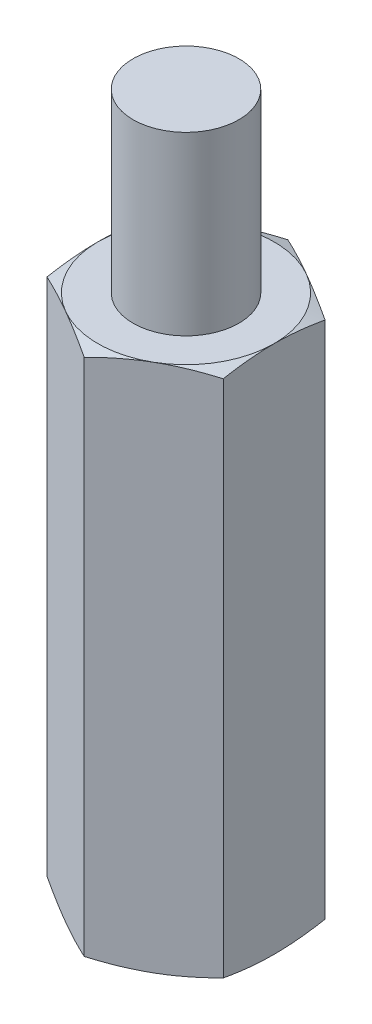
ISO-10303-21;
HEADER;
FILE_DESCRIPTION(('STEP AP214'),'2;1');
FILE_NAME('part.step','',(''),(''),'','','');
FILE_SCHEMA(('AUTOMOTIVE_DESIGN { 1 0 10303 214 1 1 1 1 }'));
ENDSEC;
DATA;
#1=APPLICATION_CONTEXT('core data for automotive mechanical design processes');
#2=APPLICATION_PROTOCOL_DEFINITION('international standard','automotive_design',2000,#1);
#3=PRODUCT_CONTEXT('',#1,'mechanical');
#4=PRODUCT('Part','Part','',(#3));
#5=PRODUCT_RELATED_PRODUCT_CATEGORY('part','',(#4));
#6=PRODUCT_DEFINITION_FORMATION('','',#4);
#7=PRODUCT_DEFINITION_CONTEXT('part definition',#1,'design');
#8=PRODUCT_DEFINITION('design','',#6,#7);
#9=PRODUCT_DEFINITION_SHAPE('','',#8);
#10=(LENGTH_UNIT() NAMED_UNIT(*) SI_UNIT(.MILLI.,.METRE.));
#11=(NAMED_UNIT(*) PLANE_ANGLE_UNIT() SI_UNIT($,.RADIAN.));
#12=(NAMED_UNIT(*) SI_UNIT($,.STERADIAN.) SOLID_ANGLE_UNIT());
#13=UNCERTAINTY_MEASURE_WITH_UNIT(LENGTH_MEASURE(1.E-05),#10,'distance_accuracy_value','');
#14=(GEOMETRIC_REPRESENTATION_CONTEXT(3) GLOBAL_UNCERTAINTY_ASSIGNED_CONTEXT((#13)) GLOBAL_UNIT_ASSIGNED_CONTEXT((#10,
#11,#12)) REPRESENTATION_CONTEXT('',''));
#15=CARTESIAN_POINT('',(0.,0.,0.));
#16=DIRECTION('',(0.,0.,1.));
#17=DIRECTION('',(1.,0.,0.));
#18=AXIS2_PLACEMENT_3D('',#15,#16,#17);
#19=CARTESIAN_POINT('',(0.,20.,0.));
#20=DIRECTION('',(0.,-1.,0.));
#21=DIRECTION('',(0.,0.,-1.));
#22=AXIS2_PLACEMENT_3D('',#19,#20,#21);
#23=CYLINDRICAL_SURFACE('',#22,1.5);
#24=CARTESIAN_POINT('',(0.,20.,0.));
#25=DIRECTION('',(0.,1.,0.));
#26=DIRECTION('',(0.,0.,1.));
#27=AXIS2_PLACEMENT_3D('',#24,#25,#26);
#28=CIRCLE('',#27,1.5);
#29=CARTESIAN_POINT('',(0.,20.,1.5));
#30=VERTEX_POINT('',#29);
#31=EDGE_CURVE('E11',#30,#30,#28,.T.);
#32=ORIENTED_EDGE('',*,*,#31,.F.);
#33=EDGE_LOOP('',(#32));
#34=FACE_BOUND('',#33,.T.);
#35=CARTESIAN_POINT('',(0.,15.,0.));
#36=DIRECTION('',(0.,1.,0.));
#37=DIRECTION('',(0.,0.,1.));
#38=AXIS2_PLACEMENT_3D('',#35,#36,#37);
#39=CIRCLE('',#38,1.5);
#40=CARTESIAN_POINT('',(0.,15.,1.5));
#41=VERTEX_POINT('',#40);
#42=EDGE_CURVE('E45',#41,#41,#39,.T.);
#43=ORIENTED_EDGE('',*,*,#42,.T.);
#44=EDGE_LOOP('',(#43));
#45=FACE_BOUND('',#44,.T.);
#46=ADVANCED_FACE('F42',(#34,#45),#23,.T.);
#47=CARTESIAN_POINT('',(0.,20.,0.));
#48=DIRECTION('',(0.,1.,0.));
#49=DIRECTION('',(0.,0.,1.));
#50=AXIS2_PLACEMENT_3D('',#47,#48,#49);
#51=PLANE('',#50);
#52=ORIENTED_EDGE('',*,*,#31,.T.);
#53=EDGE_LOOP('',(#52));
#54=FACE_BOUND('',#53,.T.);
#55=ADVANCED_FACE('F57',(#54),#51,.T.);
#56=CARTESIAN_POINT('',(0.,15.,0.));
#57=DIRECTION('',(0.,1.,0.));
#58=DIRECTION('',(0.,0.,1.));
#59=AXIS2_PLACEMENT_3D('',#56,#57,#58);
#60=PLANE('',#59);
#61=ORIENTED_EDGE('',*,*,#42,.F.);
#62=EDGE_LOOP('',(#61));
#63=FACE_BOUND('',#62,.T.);
#64=ADVANCED_FACE('F55',(#63),#60,.F.);
#65=CLOSED_SHELL('',(#46,#55,#64));
#66=MANIFOLD_SOLID_BREP('B2',#65);
#67=CARTESIAN_POINT('',(0.,15.,0.));
#68=DIRECTION('',(0.,1.,0.));
#69=DIRECTION('',(0.,0.,1.));
#70=AXIS2_PLACEMENT_3D('',#67,#68,#69);
#71=PLANE('',#70);
#72=CARTESIAN_POINT('',(0.,15.,0.));
#73=DIRECTION('',(0.,-1.,0.));
#74=DIRECTION('',(0.,0.,-1.));
#75=AXIS2_PLACEMENT_3D('',#72,#73,#74);
#76=CIRCLE('',#75,2.5);
#77=CARTESIAN_POINT('',(-1.24999999999999,15.,2.1650635094611));
#78=VERTEX_POINT('',#77);
#79=CARTESIAN_POINT('',(-2.5,15.,0.));
#80=VERTEX_POINT('',#79);
#81=EDGE_CURVE('E389',#78,#80,#76,.T.);
#82=ORIENTED_EDGE('',*,*,#81,.F.);
#83=CARTESIAN_POINT('',(1.25000000000002,15.,2.16506350946109));
#84=VERTEX_POINT('',#83);
#85=EDGE_CURVE('E387',#84,#78,#76,.T.);
#86=ORIENTED_EDGE('',*,*,#85,.F.);
#87=CARTESIAN_POINT('',(2.5,15.,0.));
#88=VERTEX_POINT('',#87);
#89=EDGE_CURVE('E385',#88,#84,#76,.T.);
#90=ORIENTED_EDGE('',*,*,#89,.F.);
#91=CARTESIAN_POINT('',(1.24999999999999,15.,-2.16506350946111));
#92=VERTEX_POINT('',#91);
#93=EDGE_CURVE('E292',#92,#88,#76,.T.);
#94=ORIENTED_EDGE('',*,*,#93,.F.);
#95=CARTESIAN_POINT('',(-1.25,15.,-2.1650635094611));
#96=VERTEX_POINT('',#95);
#97=EDGE_CURVE('E388',#96,#92,#76,.T.);
#98=ORIENTED_EDGE('',*,*,#97,.F.);
#99=EDGE_CURVE('E393',#80,#96,#76,.T.);
#100=ORIENTED_EDGE('',*,*,#99,.F.);
#101=EDGE_LOOP('',(#82,#86,#90,#94,#98,#100));
#102=FACE_BOUND('',#101,.T.);
#103=CARTESIAN_POINT('',(0.,15.,0.));
#104=DIRECTION('',(0.,1.,0.));
#105=DIRECTION('',(0.,0.,1.));
#106=AXIS2_PLACEMENT_3D('',#103,#104,#105);
#107=CIRCLE('',#106,1.5);
#108=CARTESIAN_POINT('',(0.,15.,1.5));
#109=VERTEX_POINT('',#108);
#110=EDGE_CURVE('E355',#109,#109,#107,.T.);
#111=ORIENTED_EDGE('',*,*,#110,.F.);
#112=EDGE_LOOP('',(#111));
#113=FACE_BOUND('',#112,.T.);
#114=ADVANCED_FACE('F82',(#102,#113),#71,.T.);
#115=CARTESIAN_POINT('',(0.,0.,0.));
#116=DIRECTION('',(0.,1.,0.));
#117=DIRECTION('',(0.,0.,1.));
#118=AXIS2_PLACEMENT_3D('',#115,#116,#117);
#119=PLANE('',#118);
#120=CARTESIAN_POINT('',(0.,0.,0.));
#121=DIRECTION('',(0.,-1.,0.));
#122=DIRECTION('',(0.,0.,-1.));
#123=AXIS2_PLACEMENT_3D('',#120,#121,#122);
#124=CIRCLE('',#123,2.5);
#125=CARTESIAN_POINT('',(1.25000000000002,0.,2.16506350946109));
#126=VERTEX_POINT('',#125);
#127=CARTESIAN_POINT('',(-1.24999999999999,0.,2.1650635094611));
#128=VERTEX_POINT('',#127);
#129=EDGE_CURVE('E187',#126,#128,#124,.T.);
#130=ORIENTED_EDGE('',*,*,#129,.T.);
#131=CARTESIAN_POINT('',(-2.5,0.,0.));
#132=VERTEX_POINT('',#131);
#133=EDGE_CURVE('E210',#128,#132,#124,.T.);
#134=ORIENTED_EDGE('',*,*,#133,.T.);
#135=CARTESIAN_POINT('',(-1.25,0.,-2.1650635094611));
#136=VERTEX_POINT('',#135);
#137=EDGE_CURVE('E209',#132,#136,#124,.T.);
#138=ORIENTED_EDGE('',*,*,#137,.T.);
#139=CARTESIAN_POINT('',(1.24999999999999,0.,-2.16506350946111));
#140=VERTEX_POINT('',#139);
#141=EDGE_CURVE('E206',#136,#140,#124,.T.);
#142=ORIENTED_EDGE('',*,*,#141,.T.);
#143=CARTESIAN_POINT('',(2.5,0.,0.));
#144=VERTEX_POINT('',#143);
#145=EDGE_CURVE('E104',#140,#144,#124,.T.);
#146=ORIENTED_EDGE('',*,*,#145,.T.);
#147=EDGE_CURVE('E180',#144,#126,#124,.T.);
#148=ORIENTED_EDGE('',*,*,#147,.T.);
#149=EDGE_LOOP('',(#130,#134,#138,#142,#146,#148));
#150=FACE_BOUND('',#149,.T.);
#151=CARTESIAN_POINT('',(0.,0.,0.));
#152=DIRECTION('',(0.,1.,0.));
#153=DIRECTION('',(0.,0.,1.));
#154=AXIS2_PLACEMENT_3D('',#151,#152,#153);
#155=CIRCLE('',#154,1.5);
#156=CARTESIAN_POINT('',(0.,0.,1.5));
#157=VERTEX_POINT('',#156);
#158=EDGE_CURVE('E358',#157,#157,#155,.T.);
#159=ORIENTED_EDGE('',*,*,#158,.T.);
#160=EDGE_LOOP('',(#159));
#161=FACE_BOUND('',#160,.T.);
#162=ADVANCED_FACE('F203',(#150,#161),#119,.F.);
#163=CARTESIAN_POINT('',(2.49999999999998,15.,-1.44337567297409));
#164=DIRECTION('',(-0.499999999999995,0.,0.866025403784442));
#165=DIRECTION('',(0.866025403784442,0.,0.499999999999995));
#166=AXIS2_PLACEMENT_3D('',#163,#164,#165);
#167=PLANE('',#166);
#168=DIRECTION('',(0.,-1.,0.));
#169=VECTOR('',#168,1.);
#170=CARTESIAN_POINT('',(2.49999999999998,15.,-1.44337567297409));
#171=LINE('',#170,#169);
#172=CARTESIAN_POINT('',(2.49999999999998,14.8592340220125,-1.44337567297409));
#173=VERTEX_POINT('',#172);
#174=CARTESIAN_POINT('',(2.49999999999998,0.140765977987508,-1.44337567297409));
#175=VERTEX_POINT('',#174);
#176=EDGE_CURVE('E361',#173,#175,#171,.T.);
#177=ORIENTED_EDGE('',*,*,#176,.T.);
#178=CARTESIAN_POINT('',(2.50019999999998,0.140808008171613,-1.44326020292026));
#179=CARTESIAN_POINT('',(2.39665305132346,0.119039069131316,-1.50304306161241));
#180=CARTESIAN_POINT('',(2.29276461388714,0.09923632869972,-1.56302307893196));
#181=CARTESIAN_POINT('',(2.08431213823202,0.0643963200817531,-1.68337317186468));
#182=CARTESIAN_POINT('',(1.97974763612162,0.0493627822141141,-1.7437435153058));
#183=CARTESIAN_POINT('',(1.77110364851345,0.0250464111610833,-1.86420417771618));
#184=CARTESIAN_POINT('',(1.6670289296066,0.0157105319226292,-1.92429174469288));
#185=CARTESIAN_POINT('',(1.45863606978594,0.00318847973073288,-2.04460741840753));
#186=CARTESIAN_POINT('',(1.35431803489297,0.,-2.10483546393432));
#187=CARTESIAN_POINT('',(1.14568196510702,0.,-2.2252915549879));
#188=CARTESIAN_POINT('',(1.04136393021405,0.00318847973073293,-2.28551960051469));
#189=CARTESIAN_POINT('',(0.832971070393384,0.0157105319226293,-2.40583527422935));
#190=CARTESIAN_POINT('',(0.728896351486535,0.0250464111610833,-2.46592284120605));
#191=CARTESIAN_POINT('',(0.520252363878367,0.0493627822141141,-2.58638350361642));
#192=CARTESIAN_POINT('',(0.41568786176796,0.0643963200817531,-2.64675384705754));
#193=CARTESIAN_POINT('',(0.207235386112847,0.09923632869972,-2.76710393999026));
#194=CARTESIAN_POINT('',(0.103346948676526,0.119039069131316,-2.82708395730981));
#195=CARTESIAN_POINT('',(-0.000200000000000308,0.140808008171613,-2.88686681600197));
#196=B_SPLINE_CURVE_WITH_KNOTS('',3,(#178,#179,#180,#181,#182,#183,#184,#185,#186,#187,#188,
#189,#190,#191,#192,#193,#194,#195),.UNSPECIFIED.,.F.,.F.,(4,2,2,2,2,2,2,2,4),(0.,
0.364631406980056,0.729547317866326,1.09101180768958,1.45234063356534,1.8136694594411,
2.17513394926436,2.54004986015063,2.90468126713069),.UNSPECIFIED.);
#197=EDGE_CURVE('E192',#175,#140,#196,.T.);
#198=ORIENTED_EDGE('',*,*,#197,.T.);
#199=CARTESIAN_POINT('',(0.,0.140765977987508,-2.88675134594813));
#200=VERTEX_POINT('',#199);
#201=EDGE_CURVE('E400',#140,#200,#196,.T.);
#202=ORIENTED_EDGE('',*,*,#201,.T.);
#203=DIRECTION('',(0.,-1.,0.));
#204=VECTOR('',#203,1.);
#205=CARTESIAN_POINT('',(0.,15.,-2.88675134594813));
#206=LINE('',#205,#204);
#207=CARTESIAN_POINT('',(0.,14.8592340220125,-2.88675134594813));
#208=VERTEX_POINT('',#207);
#209=EDGE_CURVE('E371',#208,#200,#206,.T.);
#210=ORIENTED_EDGE('',*,*,#209,.F.);
#211=CARTESIAN_POINT('',(-0.0002,14.8591919918284,-2.88686681600197));
#212=CARTESIAN_POINT('',(0.103346948676526,14.8809609308687,-2.82708395730981));
#213=CARTESIAN_POINT('',(0.207235386112847,14.9007636713003,-2.76710393999026));
#214=CARTESIAN_POINT('',(0.41568786176796,14.9356036799182,-2.64675384705754));
#215=CARTESIAN_POINT('',(0.520252363878367,14.9506372177859,-2.58638350361642));
#216=CARTESIAN_POINT('',(0.728896351486535,14.9749535888389,-2.46592284120605));
#217=CARTESIAN_POINT('',(0.832971070393384,14.9842894680774,-2.40583527422935));
#218=CARTESIAN_POINT('',(1.04136393021405,14.9968115202693,-2.28551960051469));
#219=CARTESIAN_POINT('',(1.14568196510702,15.,-2.2252915549879));
#220=CARTESIAN_POINT('',(1.35431803489297,15.,-2.10483546393432));
#221=CARTESIAN_POINT('',(1.45863606978594,14.9968115202693,-2.04460741840753));
#222=CARTESIAN_POINT('',(1.6670289296066,14.9842894680774,-1.92429174469288));
#223=CARTESIAN_POINT('',(1.77110364851345,14.9749535888389,-1.86420417771618));
#224=CARTESIAN_POINT('',(1.97974763612162,14.9506372177859,-1.74374351530581));
#225=CARTESIAN_POINT('',(2.08431213823202,14.9356036799182,-1.68337317186468));
#226=CARTESIAN_POINT('',(2.29276461388714,14.9007636713003,-1.56302307893196));
#227=CARTESIAN_POINT('',(2.39665305132346,14.8809609308687,-1.50304306161241));
#228=CARTESIAN_POINT('',(2.50019999999998,14.8591919918284,-1.44326020292026));
#229=B_SPLINE_CURVE_WITH_KNOTS('',3,(#211,#212,#213,#214,#215,#216,#217,#218,#219,#220,#221,
#222,#223,#224,#225,#226,#227,#228),.UNSPECIFIED.,.F.,.F.,(4,2,2,2,2,2,2,2,4),(0.,
0.364631406980055,0.729547317866326,1.09101180768958,1.45234063356534,1.8136694594411,
2.17513394926436,2.54004986015063,2.90468126713068),.UNSPECIFIED.);
#230=EDGE_CURVE('E300',#208,#92,#229,.T.);
#231=ORIENTED_EDGE('',*,*,#230,.T.);
#232=EDGE_CURVE('E291',#92,#173,#229,.T.);
#233=ORIENTED_EDGE('',*,*,#232,.T.);
#234=EDGE_LOOP('',(#177,#198,#202,#210,#231,#233));
#235=FACE_BOUND('',#234,.T.);
#236=ADVANCED_FACE('F84',(#235),#167,.F.);
#237=CARTESIAN_POINT('',(0.,15.,-2.88675134594813));
#238=DIRECTION('',(0.500000000000001,0.,0.866025403784438));
#239=DIRECTION('',(0.866025403784438,0.,-0.500000000000001));
#240=AXIS2_PLACEMENT_3D('',#237,#238,#239);
#241=PLANE('',#240);
#242=ORIENTED_EDGE('',*,*,#209,.T.);
#243=CARTESIAN_POINT('',(0.000200000000000055,0.140808008171613,-2.88686681600197));
#244=CARTESIAN_POINT('',(-0.103346948676527,0.119039069131316,-2.82708395730981));
#245=CARTESIAN_POINT('',(-0.207235386112849,0.0992363286997191,-2.76710393999026));
#246=CARTESIAN_POINT('',(-0.415687861767963,0.0643963200817513,-2.64675384705754));
#247=CARTESIAN_POINT('',(-0.520252363878371,0.0493627822141118,-2.58638350361641));
#248=CARTESIAN_POINT('',(-0.728896351486541,0.0250464111610803,-2.46592284120604));
#249=CARTESIAN_POINT('',(-0.832971070393391,0.015710531922626,-2.40583527422933));
#250=CARTESIAN_POINT('',(-1.04136393021405,0.00318847973072929,-2.28551960051468));
#251=CARTESIAN_POINT('',(-1.14568196510703,0.,-2.22529155498789));
#252=CARTESIAN_POINT('',(-1.35431803489298,0.,-2.1048354639343));
#253=CARTESIAN_POINT('',(-1.45863606978595,0.00318847973072927,-2.04460741840751));
#254=CARTESIAN_POINT('',(-1.66702892960661,0.0157105319226259,-1.92429174469286));
#255=CARTESIAN_POINT('',(-1.77110364851346,0.0250464111610802,-1.86420417771615));
#256=CARTESIAN_POINT('',(-1.97974763612163,0.0493627822141117,-1.74374351530578));
#257=CARTESIAN_POINT('',(-2.08431213823204,0.0643963200817511,-1.68337317186465));
#258=CARTESIAN_POINT('',(-2.29276461388716,0.099236328699719,-1.56302307893193));
#259=CARTESIAN_POINT('',(-2.39665305132348,0.119039069131316,-1.50304306161238));
#260=CARTESIAN_POINT('',(-2.5002,0.140808008171613,-1.44326020292022));
#261=B_SPLINE_CURVE_WITH_KNOTS('',3,(#243,#244,#245,#246,#247,#248,#249,#250,#251,#252,#253,
#254,#255,#256,#257,#258,#259,#260),.UNSPECIFIED.,.F.,.F.,(4,2,2,2,2,2,2,2,4),(0.,
0.36463140698006,0.729547317866335,1.0910118076896,1.45234063356536,1.81366945944112,
2.17513394926439,2.54004986015066,2.90468126713072),.UNSPECIFIED.);
#262=EDGE_CURVE('E238',#200,#136,#261,.T.);
#263=ORIENTED_EDGE('',*,*,#262,.T.);
#264=CARTESIAN_POINT('',(-2.5,0.140765977987508,-1.44337567297406));
#265=VERTEX_POINT('',#264);
#266=EDGE_CURVE('E237',#136,#265,#261,.T.);
#267=ORIENTED_EDGE('',*,*,#266,.T.);
#268=DIRECTION('',(0.,-1.,0.));
#269=VECTOR('',#268,1.);
#270=CARTESIAN_POINT('',(-2.5,15.,-1.44337567297406));
#271=LINE('',#270,#269);
#272=CARTESIAN_POINT('',(-2.5,14.8592340220125,-1.44337567297406));
#273=VERTEX_POINT('',#272);
#274=EDGE_CURVE('E233',#273,#265,#271,.T.);
#275=ORIENTED_EDGE('',*,*,#274,.F.);
#276=CARTESIAN_POINT('',(-2.5002,14.8591919918284,-1.44326020292022));
#277=CARTESIAN_POINT('',(-2.39665305132348,14.8809609308687,-1.50304306161238));
#278=CARTESIAN_POINT('',(-2.29276461388716,14.9007636713003,-1.56302307893193));
#279=CARTESIAN_POINT('',(-2.08431213823204,14.9356036799182,-1.68337317186465));
#280=CARTESIAN_POINT('',(-1.97974763612163,14.9506372177859,-1.74374351530578));
#281=CARTESIAN_POINT('',(-1.77110364851346,14.9749535888389,-1.86420417771615));
#282=CARTESIAN_POINT('',(-1.66702892960661,14.9842894680774,-1.92429174469286));
#283=CARTESIAN_POINT('',(-1.45863606978595,14.9968115202693,-2.04460741840751));
#284=CARTESIAN_POINT('',(-1.35431803489298,15.,-2.1048354639343));
#285=CARTESIAN_POINT('',(-1.14568196510703,15.,-2.22529155498789));
#286=CARTESIAN_POINT('',(-1.04136393021405,14.9968115202693,-2.28551960051468));
#287=CARTESIAN_POINT('',(-0.832971070393391,14.9842894680774,-2.40583527422933));
#288=CARTESIAN_POINT('',(-0.728896351486541,14.9749535888389,-2.46592284120604));
#289=CARTESIAN_POINT('',(-0.520252363878371,14.9506372177859,-2.58638350361641));
#290=CARTESIAN_POINT('',(-0.415687861767963,14.9356036799182,-2.64675384705754));
#291=CARTESIAN_POINT('',(-0.207235386112849,14.9007636713003,-2.76710393999026));
#292=CARTESIAN_POINT('',(-0.103346948676527,14.8809609308687,-2.82708395730981));
#293=CARTESIAN_POINT('',(0.000199999999999991,14.8591919918284,-2.88686681600197));
#294=B_SPLINE_CURVE_WITH_KNOTS('',3,(#276,#277,#278,#279,#280,#281,#282,#283,#284,#285,#286,
#287,#288,#289,#290,#291,#292,#293),.UNSPECIFIED.,.F.,.F.,(4,2,2,2,2,2,2,2,4),(0.,
0.364631406980061,0.729547317866335,1.0910118076896,1.45234063356536,1.81366945944113,
2.17513394926439,2.54004986015066,2.90468126713072),.UNSPECIFIED.);
#295=EDGE_CURVE('E316',#273,#96,#294,.T.);
#296=ORIENTED_EDGE('',*,*,#295,.T.);
#297=EDGE_CURVE('E308',#96,#208,#294,.T.);
#298=ORIENTED_EDGE('',*,*,#297,.T.);
#299=EDGE_LOOP('',(#242,#263,#267,#275,#296,#298));
#300=FACE_BOUND('',#299,.T.);
#301=ADVANCED_FACE('F323',(#300),#241,.F.);
#302=CARTESIAN_POINT('',(-2.5,15.,-1.44337567297406));
#303=DIRECTION('',(1.,0.,0.));
#304=DIRECTION('',(0.,0.,-1.));
#305=AXIS2_PLACEMENT_3D('',#302,#303,#304);
#306=PLANE('',#305);
#307=ORIENTED_EDGE('',*,*,#274,.T.);
#308=CARTESIAN_POINT('',(-2.50000000000001,0.9110699184983,-4.33375705030874));
#309=CARTESIAN_POINT('',(-2.50000000000001,0.857151962741823,-4.1626121487893));
#310=CARTESIAN_POINT('',(-2.50000000000001,0.803889247670853,-3.99125292656234));
#311=CARTESIAN_POINT('',(-2.50000000000001,0.699303356408641,-3.64790122960471));
#312=CARTESIAN_POINT('',(-2.50000000000001,0.647980635713855,-3.47590861643412));
#313=CARTESIAN_POINT('',(-2.50000000000001,0.547192255797207,-3.12862476065282));
#314=CARTESIAN_POINT('',(-2.50000000000001,0.497765115102524,-2.95332226186824));
#315=CARTESIAN_POINT('',(-2.50000000000001,0.402640277745627,-2.60170577064686));
#316=CARTESIAN_POINT('',(-2.50000000000001,0.356942439150253,-2.42539181697853));
#317=CARTESIAN_POINT('',(-2.50000000000001,0.272638394402247,-2.07901596617803));
#318=CARTESIAN_POINT('',(-2.50000000000001,0.233812857215179,-1.90900813322598));
#319=CARTESIAN_POINT('',(-2.50000000000001,0.162867038370292,-1.56755699875984));
#320=CARTESIAN_POINT('',(-2.5,0.13074720665615,-1.39611360172362));
#321=CARTESIAN_POINT('',(-2.5,0.0758518227791731,-1.05306244520638));
#322=CARTESIAN_POINT('',(-2.5,0.0530056159219257,-0.881466309778352));
#323=CARTESIAN_POINT('',(-2.5,0.0188225697475301,-0.53712766793492));
#324=CARTESIAN_POINT('',(-2.5,0.0074816908407242,-0.364385585324937));
#325=CARTESIAN_POINT('',(-2.5,4.41044611649526E-05,-0.0973938847143227));
#326=CARTESIAN_POINT('',(-2.5,-0.000644888189889895,-0.00325681931261538));
#327=CARTESIAN_POINT('',(-2.5,0.00184631107398246,0.184970103743134));
#328=CARTESIAN_POINT('',(-2.5,0.00502655264592196,0.279059960775809));
#329=CARTESIAN_POINT('',(-2.5,0.0151239518844856,0.467060430735544));
#330=CARTESIAN_POINT('',(-2.5,0.0220420903773748,0.560970990121225));
#331=CARTESIAN_POINT('',(-2.5,0.0393313521905001,0.748477331015576));
#332=CARTESIAN_POINT('',(-2.5,0.0497028075871388,0.842073081377065));
#333=CARTESIAN_POINT('',(-2.5,0.0856400575240468,1.12380926395691));
#334=CARTESIAN_POINT('',(-2.5,0.115934676805282,1.31134961033416));
#335=CARTESIAN_POINT('',(-2.49999999999999,0.18575752105665,1.68464568549846));
#336=CARTESIAN_POINT('',(-2.49999999999999,0.225286525445446,1.87040126226527));
#337=CARTESIAN_POINT('',(-2.49999999999999,0.312868160934001,2.24929384309448));
#338=CARTESIAN_POINT('',(-2.49999999999999,0.361239314019708,2.44235614952976));
#339=CARTESIAN_POINT('',(-2.49999999999999,0.462845732200086,2.8271740656917));
#340=CARTESIAN_POINT('',(-2.49999999999999,0.516080908992449,3.01892969907206));
#341=CARTESIAN_POINT('',(-2.49999999999999,0.625017863722871,3.3982782674358));
#342=CARTESIAN_POINT('',(-2.49999999999999,0.680663797121248,3.58588734311865));
#343=CARTESIAN_POINT('',(-2.49999999999999,0.765880720880509,3.86673968266628));
#344=CARTESIAN_POINT('',(-2.49999999999999,0.794573796432844,3.96025127643636));
#345=CARTESIAN_POINT('',(-2.49999999999999,0.852463883475562,4.14711653548762));
#346=CARTESIAN_POINT('',(-2.49999999999999,0.881660885655854,4.24047020365159));
#347=CARTESIAN_POINT('',(-2.49999999999999,0.9110699184983,4.33375705030875));
#348=B_SPLINE_CURVE_WITH_KNOTS('',3,(#308,#309,#310,#311,#312,#313,#314,#315,#316,#317,#318,
#319,#320,#321,#322,#323,#324,#325,#326,#327,#328,#329,#330,#331,#332,#333,#334,#335,#336,#337,
#338,#339,#340,#341,#342,#343,#344,#345,#346,#347),.UNSPECIFIED.,.F.,.F.,(4,2,2,2,2,2,2,2,2,2,2,
2,2,2,2,2,2,2,2,4),(0.,0.538321778022803,1.07676917474349,1.62315243554878,2.1695148918972,
2.69257527905727,3.21567075158281,3.73470243407135,4.25355181828759,4.53589900114561,
4.81824980763162,5.100674739136,5.38312683691471,5.95267633652753,6.52227392575273,
7.11926798158166,7.71625120163243,8.3032921668782,8.59673518713049,8.89017279178627),.UNSPECIFIED.);
#349=EDGE_CURVE('E227',#265,#132,#348,.T.);
#350=ORIENTED_EDGE('',*,*,#349,.T.);
#351=CARTESIAN_POINT('',(-2.49999999999999,0.140765977987508,1.44337567297408));
#352=VERTEX_POINT('',#351);
#353=EDGE_CURVE('E223',#132,#352,#348,.T.);
#354=ORIENTED_EDGE('',*,*,#353,.T.);
#355=DIRECTION('',(0.,-1.,0.));
#356=VECTOR('',#355,1.);
#357=CARTESIAN_POINT('',(-2.5,15.,1.44337567297408));
#358=LINE('',#357,#356);
#359=CARTESIAN_POINT('',(-2.49999999999999,14.8592340220125,1.44337567297408));
#360=VERTEX_POINT('',#359);
#361=EDGE_CURVE('E368',#360,#352,#358,.T.);
#362=ORIENTED_EDGE('',*,*,#361,.F.);
#363=CARTESIAN_POINT('',(-2.49999999999999,14.0889300815017,4.33375705030875));
#364=CARTESIAN_POINT('',(-2.49999999999999,14.1428480372582,4.16261214878932));
#365=CARTESIAN_POINT('',(-2.49999999999999,14.1961107523291,3.99125292656235));
#366=CARTESIAN_POINT('',(-2.49999999999999,14.3006966435914,3.64790122960472));
#367=CARTESIAN_POINT('',(-2.49999999999999,14.3520193642861,3.47590861643413));
#368=CARTESIAN_POINT('',(-2.49999999999999,14.4528077442028,3.12862476065284));
#369=CARTESIAN_POINT('',(-2.49999999999999,14.5022348848975,2.95332226186826));
#370=CARTESIAN_POINT('',(-2.49999999999999,14.5973597222544,2.60170577064688));
#371=CARTESIAN_POINT('',(-2.49999999999999,14.6430575608497,2.42539181697855));
#372=CARTESIAN_POINT('',(-2.49999999999999,14.7273616055978,2.07901596617805));
#373=CARTESIAN_POINT('',(-2.49999999999999,14.7661871427848,1.909008133226));
#374=CARTESIAN_POINT('',(-2.49999999999999,14.8371329616297,1.56755699875986));
#375=CARTESIAN_POINT('',(-2.5,14.8692527933438,1.39611360172364));
#376=CARTESIAN_POINT('',(-2.5,14.9241481772208,1.0530624452064));
#377=CARTESIAN_POINT('',(-2.5,14.9469943840781,0.881466309778373));
#378=CARTESIAN_POINT('',(-2.5,14.9811774302525,0.537127667934941));
#379=CARTESIAN_POINT('',(-2.5,14.9925183091593,0.364385585324958));
#380=CARTESIAN_POINT('',(-2.5,14.9999558955388,0.0973938847143442));
#381=CARTESIAN_POINT('',(-2.5,15.0006448881899,0.00325681931263691));
#382=CARTESIAN_POINT('',(-2.5,14.998153688926,-0.184970103743112));
#383=CARTESIAN_POINT('',(-2.5,14.9949734473541,-0.279059960775788));
#384=CARTESIAN_POINT('',(-2.5,14.9848760481155,-0.467060430735524));
#385=CARTESIAN_POINT('',(-2.5,14.9779579096226,-0.560970990121205));
#386=CARTESIAN_POINT('',(-2.5,14.9606686478095,-0.748477331015556));
#387=CARTESIAN_POINT('',(-2.5,14.9502971924129,-0.842073081377046));
#388=CARTESIAN_POINT('',(-2.5,14.914359942476,-1.12380926395689));
#389=CARTESIAN_POINT('',(-2.5,14.8840653231947,-1.31134961033414));
#390=CARTESIAN_POINT('',(-2.50000000000001,14.8142424789434,-1.68464568549844));
#391=CARTESIAN_POINT('',(-2.50000000000001,14.7747134745546,-1.87040126226525));
#392=CARTESIAN_POINT('',(-2.50000000000001,14.687131839066,-2.24929384309446));
#393=CARTESIAN_POINT('',(-2.50000000000001,14.6387606859803,-2.44235614952974));
#394=CARTESIAN_POINT('',(-2.50000000000001,14.5371542677999,-2.82717406569169));
#395=CARTESIAN_POINT('',(-2.50000000000001,14.4839190910076,-3.01892969907204));
#396=CARTESIAN_POINT('',(-2.50000000000001,14.3749821362771,-3.39827826743578));
#397=CARTESIAN_POINT('',(-2.50000000000001,14.3193362028788,-3.58588734311863));
#398=CARTESIAN_POINT('',(-2.50000000000001,14.2341192791195,-3.86673968266627));
#399=CARTESIAN_POINT('',(-2.50000000000001,14.2054262035672,-3.96025127643634));
#400=CARTESIAN_POINT('',(-2.50000000000001,14.1475361165244,-4.14711653548761));
#401=CARTESIAN_POINT('',(-2.50000000000001,14.1183391143441,-4.24047020365157));
#402=CARTESIAN_POINT('',(-2.50000000000001,14.0889300815017,-4.33375705030874));
#403=B_SPLINE_CURVE_WITH_KNOTS('',3,(#363,#364,#365,#366,#367,#368,#369,#370,#371,#372,#373,
#374,#375,#376,#377,#378,#379,#380,#381,#382,#383,#384,#385,#386,#387,#388,#389,#390,#391,#392,
#393,#394,#395,#396,#397,#398,#399,#400,#401,#402),.UNSPECIFIED.,.F.,.F.,(4,2,2,2,2,2,2,2,2,2,2,
2,2,2,2,2,2,2,2,4),(0.,0.538321778022802,1.07676917474349,1.62315243554878,2.1695148918972,
2.69257527905726,3.21567075158281,3.73470243407135,4.25355181828758,4.5358990011456,
4.81824980763162,5.10067473913599,5.3831268369147,5.95267633652753,6.52227392575273,
7.11926798158166,7.71625120163243,8.3032921668782,8.59673518713049,8.89017279178627),.UNSPECIFIED.);
#404=EDGE_CURVE('E359',#360,#80,#403,.T.);
#405=ORIENTED_EDGE('',*,*,#404,.T.);
#406=EDGE_CURVE('E317',#80,#273,#403,.T.);
#407=ORIENTED_EDGE('',*,*,#406,.T.);
#408=EDGE_LOOP('',(#307,#350,#354,#362,#405,#407));
#409=FACE_BOUND('',#408,.T.);
#410=ADVANCED_FACE('F230',(#409),#306,.F.);
#411=CARTESIAN_POINT('',(-2.5,15.,1.44337567297408));
#412=DIRECTION('',(0.499999999999995,0.,-0.866025403784442));
#413=DIRECTION('',(-0.866025403784442,0.,-0.499999999999995));
#414=AXIS2_PLACEMENT_3D('',#411,#412,#413);
#415=PLANE('',#414);
#416=ORIENTED_EDGE('',*,*,#361,.T.);
#417=CARTESIAN_POINT('',(-2.5002,0.140808008171613,1.44326020292024));
#418=CARTESIAN_POINT('',(-2.39665305132347,0.119039069131316,1.5030430616124));
#419=CARTESIAN_POINT('',(-2.29276461388715,0.0992363286997191,1.56302307893195));
#420=CARTESIAN_POINT('',(-2.08431213823203,0.0643963200817513,1.68337317186467));
#421=CARTESIAN_POINT('',(-1.97974763612162,0.0493627822141118,1.74374351530579));
#422=CARTESIAN_POINT('',(-1.77110364851345,0.0250464111610802,1.86420417771616));
#423=CARTESIAN_POINT('',(-1.6670289296066,0.0157105319226259,1.92429174469287));
#424=CARTESIAN_POINT('',(-1.45863606978594,0.00318847973072917,2.04460741840752));
#425=CARTESIAN_POINT('',(-1.35431803489296,0.,2.10483546393431));
#426=CARTESIAN_POINT('',(-1.14568196510701,0.,2.22529155498789));
#427=CARTESIAN_POINT('',(-1.04136393021404,0.00318847973072924,2.28551960051469));
#428=CARTESIAN_POINT('',(-0.832971070393375,0.0157105319226259,2.40583527422934));
#429=CARTESIAN_POINT('',(-0.728896351486524,0.0250464111610802,2.46592284120604));
#430=CARTESIAN_POINT('',(-0.520252363878353,0.0493627822141116,2.58638350361642));
#431=CARTESIAN_POINT('',(-0.415687861767945,0.064396320081751,2.64675384705754));
#432=CARTESIAN_POINT('',(-0.20723538611283,0.0992363286997188,2.76710393999026));
#433=CARTESIAN_POINT('',(-0.103346948676507,0.119039069131316,2.82708395730981));
#434=CARTESIAN_POINT('',(0.000200000000020177,0.140808008171613,2.88686681600197));
#435=B_SPLINE_CURVE_WITH_KNOTS('',3,(#417,#418,#419,#420,#421,#422,#423,#424,#425,#426,#427,
#428,#429,#430,#431,#432,#433,#434),.UNSPECIFIED.,.F.,.F.,(4,2,2,2,2,2,2,2,4),(0.,
0.364631406980059,0.729547317866335,1.0910118076896,1.45234063356536,1.81366945944112,
2.17513394926439,2.54004986015066,2.90468126713072),.UNSPECIFIED.);
#436=EDGE_CURVE('E112',#352,#128,#435,.T.);
#437=ORIENTED_EDGE('',*,*,#436,.T.);
#438=CARTESIAN_POINT('',(0.,0.140765977987508,2.88675134594813));
#439=VERTEX_POINT('',#438);
#440=EDGE_CURVE('E215',#128,#439,#435,.T.);
#441=ORIENTED_EDGE('',*,*,#440,.T.);
#442=DIRECTION('',(0.,-1.,0.));
#443=VECTOR('',#442,1.);
#444=CARTESIAN_POINT('',(0.,15.,2.88675134594813));
#445=LINE('',#444,#443);
#446=CARTESIAN_POINT('',(0.,14.8592340220125,2.88675134594813));
#447=VERTEX_POINT('',#446);
#448=EDGE_CURVE('E366',#447,#439,#445,.T.);
#449=ORIENTED_EDGE('',*,*,#448,.F.);
#450=CARTESIAN_POINT('',(0.000200000000020158,14.8591919918284,2.88686681600197));
#451=CARTESIAN_POINT('',(-0.103346948676507,14.8809609308687,2.82708395730981));
#452=CARTESIAN_POINT('',(-0.20723538611283,14.9007636713003,2.76710393999026));
#453=CARTESIAN_POINT('',(-0.415687861767945,14.9356036799182,2.64675384705754));
#454=CARTESIAN_POINT('',(-0.520252363878353,14.9506372177859,2.58638350361642));
#455=CARTESIAN_POINT('',(-0.728896351486524,14.9749535888389,2.46592284120604));
#456=CARTESIAN_POINT('',(-0.832971070393375,14.9842894680774,2.40583527422934));
#457=CARTESIAN_POINT('',(-1.04136393021404,14.9968115202693,2.28551960051469));
#458=CARTESIAN_POINT('',(-1.14568196510701,15.,2.22529155498789));
#459=CARTESIAN_POINT('',(-1.35431803489296,15.,2.10483546393431));
#460=CARTESIAN_POINT('',(-1.45863606978594,14.9968115202693,2.04460741840752));
#461=CARTESIAN_POINT('',(-1.6670289296066,14.9842894680774,1.92429174469287));
#462=CARTESIAN_POINT('',(-1.77110364851345,14.9749535888389,1.86420417771616));
#463=CARTESIAN_POINT('',(-1.97974763612162,14.9506372177859,1.74374351530579));
#464=CARTESIAN_POINT('',(-2.08431213823203,14.9356036799182,1.68337317186467));
#465=CARTESIAN_POINT('',(-2.29276461388715,14.9007636713003,1.56302307893195));
#466=CARTESIAN_POINT('',(-2.39665305132347,14.8809609308687,1.5030430616124));
#467=CARTESIAN_POINT('',(-2.5002,14.8591919918284,1.44326020292024));
#468=B_SPLINE_CURVE_WITH_KNOTS('',3,(#450,#451,#452,#453,#454,#455,#456,#457,#458,#459,#460,
#461,#462,#463,#464,#465,#466,#467),.UNSPECIFIED.,.F.,.F.,(4,2,2,2,2,2,2,2,4),(0.,
0.36463140698006,0.729547317866335,1.0910118076896,1.45234063356536,1.81366945944113,
2.17513394926439,2.54004986015066,2.90468126713072),.UNSPECIFIED.);
#469=EDGE_CURVE('E301',#447,#78,#468,.T.);
#470=ORIENTED_EDGE('',*,*,#469,.T.);
#471=EDGE_CURVE('E309',#78,#360,#468,.T.);
#472=ORIENTED_EDGE('',*,*,#471,.T.);
#473=EDGE_LOOP('',(#416,#437,#441,#449,#470,#472));
#474=FACE_BOUND('',#473,.T.);
#475=ADVANCED_FACE('F277',(#474),#415,.F.);
#476=CARTESIAN_POINT('',(0.,15.,2.88675134594813));
#477=DIRECTION('',(-0.500000000000007,0.,-0.866025403784435));
#478=DIRECTION('',(-0.866025403784435,0.,0.500000000000007));
#479=AXIS2_PLACEMENT_3D('',#476,#477,#478);
#480=PLANE('',#479);
#481=ORIENTED_EDGE('',*,*,#448,.T.);
#482=CARTESIAN_POINT('',(-0.000199999999979892,0.140808008171613,2.88686681600197));
#483=CARTESIAN_POINT('',(0.103346948676547,0.119039069131316,2.82708395730981));
#484=CARTESIAN_POINT('',(0.207235386112869,0.0992363286997187,2.76710393999026));
#485=CARTESIAN_POINT('',(0.415687861767982,0.064396320081751,2.64675384705753));
#486=CARTESIAN_POINT('',(0.520252363878389,0.0493627822141117,2.58638350361641));
#487=CARTESIAN_POINT('',(0.728896351486558,0.0250464111610802,2.46592284120603));
#488=CARTESIAN_POINT('',(0.832971070393408,0.015710531922626,2.40583527422933));
#489=CARTESIAN_POINT('',(1.04136393021407,0.00318847973072924,2.28551960051467));
#490=CARTESIAN_POINT('',(1.14568196510704,0.,2.22529155498788));
#491=CARTESIAN_POINT('',(1.35431803489299,0.,2.10483546393429));
#492=CARTESIAN_POINT('',(1.45863606978597,0.0031884797307292,2.0446074184075));
#493=CARTESIAN_POINT('',(1.66702892960663,0.0157105319226259,1.92429174469284));
#494=CARTESIAN_POINT('',(1.77110364851348,0.0250464111610802,1.86420417771614));
#495=CARTESIAN_POINT('',(1.97974763612165,0.0493627822141118,1.74374351530576));
#496=CARTESIAN_POINT('',(2.08431213823205,0.0643963200817513,1.68337317186464));
#497=CARTESIAN_POINT('',(2.29276461388717,0.0992363286997191,1.56302307893191));
#498=CARTESIAN_POINT('',(2.39665305132349,0.119039069131316,1.50304306161236));
#499=CARTESIAN_POINT('',(2.50020000000002,0.140808008171613,1.4432602029202));
#500=B_SPLINE_CURVE_WITH_KNOTS('',3,(#482,#483,#484,#485,#486,#487,#488,#489,#490,#491,#492,
#493,#494,#495,#496,#497,#498,#499),.UNSPECIFIED.,.F.,.F.,(4,2,2,2,2,2,2,2,4),(0.,
0.36463140698006,0.729547317866335,1.0910118076896,1.45234063356536,1.81366945944112,
2.17513394926439,2.54004986015066,2.90468126713072),.UNSPECIFIED.);
#501=EDGE_CURVE('E207',#439,#126,#500,.T.);
#502=ORIENTED_EDGE('',*,*,#501,.T.);
#503=CARTESIAN_POINT('',(2.50000000000001,0.140765977987508,1.44337567297404));
#504=VERTEX_POINT('',#503);
#505=EDGE_CURVE('E183',#126,#504,#500,.T.);
#506=ORIENTED_EDGE('',*,*,#505,.T.);
#507=DIRECTION('',(0.,-1.,0.));
#508=VECTOR('',#507,1.);
#509=CARTESIAN_POINT('',(2.50000000000002,15.,1.44337567297404));
#510=LINE('',#509,#508);
#511=CARTESIAN_POINT('',(2.50000000000002,14.8592340220125,1.44337567297404));
#512=VERTEX_POINT('',#511);
#513=EDGE_CURVE('E201',#512,#504,#510,.T.);
#514=ORIENTED_EDGE('',*,*,#513,.F.);
#515=CARTESIAN_POINT('',(2.50020000000002,14.8591919918284,1.4432602029202));
#516=CARTESIAN_POINT('',(2.39665305132349,14.8809609308687,1.50304306161236));
#517=CARTESIAN_POINT('',(2.29276461388717,14.9007636713003,1.56302307893191));
#518=CARTESIAN_POINT('',(2.08431213823205,14.9356036799182,1.68337317186464));
#519=CARTESIAN_POINT('',(1.97974763612165,14.9506372177859,1.74374351530576));
#520=CARTESIAN_POINT('',(1.77110364851348,14.9749535888389,1.86420417771614));
#521=CARTESIAN_POINT('',(1.66702892960663,14.9842894680774,1.92429174469284));
#522=CARTESIAN_POINT('',(1.45863606978597,14.9968115202693,2.0446074184075));
#523=CARTESIAN_POINT('',(1.35431803489299,15.,2.10483546393429));
#524=CARTESIAN_POINT('',(1.14568196510704,15.,2.22529155498788));
#525=CARTESIAN_POINT('',(1.04136393021407,14.9968115202693,2.28551960051467));
#526=CARTESIAN_POINT('',(0.832971070393408,14.9842894680774,2.40583527422933));
#527=CARTESIAN_POINT('',(0.728896351486559,14.9749535888389,2.46592284120603));
#528=CARTESIAN_POINT('',(0.520252363878389,14.9506372177859,2.58638350361641));
#529=CARTESIAN_POINT('',(0.415687861767982,14.9356036799182,2.64675384705753));
#530=CARTESIAN_POINT('',(0.207235386112869,14.9007636713003,2.76710393999026));
#531=CARTESIAN_POINT('',(0.103346948676547,14.8809609308687,2.82708395730981));
#532=CARTESIAN_POINT('',(-0.000199999999979742,14.8591919918284,2.88686681600197));
#533=B_SPLINE_CURVE_WITH_KNOTS('',3,(#515,#516,#517,#518,#519,#520,#521,#522,#523,#524,#525,
#526,#527,#528,#529,#530,#531,#532),.UNSPECIFIED.,.F.,.F.,(4,2,2,2,2,2,2,2,4),(0.,
0.36463140698006,0.729547317866335,1.0910118076896,1.45234063356536,1.81366945944112,
2.17513394926439,2.54004986015066,2.90468126713072),.UNSPECIFIED.);
#534=EDGE_CURVE('E284',#512,#84,#533,.T.);
#535=ORIENTED_EDGE('',*,*,#534,.T.);
#536=EDGE_CURVE('E293',#84,#447,#533,.T.);
#537=ORIENTED_EDGE('',*,*,#536,.T.);
#538=EDGE_LOOP('',(#481,#502,#506,#514,#535,#537));
#539=FACE_BOUND('',#538,.T.);
#540=ADVANCED_FACE('F274',(#539),#480,.F.);
#541=CARTESIAN_POINT('',(2.50000000000002,15.,1.44337567297404));
#542=DIRECTION('',(-1.,0.,0.));
#543=DIRECTION('',(0.,0.,1.));
#544=AXIS2_PLACEMENT_3D('',#541,#542,#543);
#545=PLANE('',#544);
#546=ORIENTED_EDGE('',*,*,#513,.T.);
#547=CARTESIAN_POINT('',(2.50000000000005,0.9110699184983,4.33375705030872));
#548=CARTESIAN_POINT('',(2.50000000000004,0.857151962741823,4.16261214878929));
#549=CARTESIAN_POINT('',(2.50000000000004,0.803889247670853,3.99125292656232));
#550=CARTESIAN_POINT('',(2.50000000000004,0.699303356408642,3.64790122960469));
#551=CARTESIAN_POINT('',(2.50000000000004,0.647980635713855,3.4759086164341));
#552=CARTESIAN_POINT('',(2.50000000000003,0.547192255797207,3.1286247606528));
#553=CARTESIAN_POINT('',(2.50000000000003,0.497765115102524,2.95332226186823));
#554=CARTESIAN_POINT('',(2.50000000000003,0.402640277745628,2.60170577064685));
#555=CARTESIAN_POINT('',(2.50000000000003,0.356942439150254,2.42539181697852));
#556=CARTESIAN_POINT('',(2.50000000000002,0.272638394402247,2.07901596617801));
#557=CARTESIAN_POINT('',(2.50000000000002,0.233812857215179,1.90900813322597));
#558=CARTESIAN_POINT('',(2.50000000000002,0.162867038370292,1.56755699875983));
#559=CARTESIAN_POINT('',(2.50000000000001,0.13074720665615,1.3961136017236));
#560=CARTESIAN_POINT('',(2.50000000000001,0.0758518227791733,1.05306244520636));
#561=CARTESIAN_POINT('',(2.50000000000001,0.0530056159219258,0.881466309778335));
#562=CARTESIAN_POINT('',(2.50000000000001,0.0188225697475303,0.537127667934903));
#563=CARTESIAN_POINT('',(2.5,0.0074816908407242,0.364385585324919));
#564=CARTESIAN_POINT('',(2.5,4.41044611649924E-05,0.0973938847143053));
#565=CARTESIAN_POINT('',(2.5,-0.000644888189889802,0.00325681931259812));
#566=CARTESIAN_POINT('',(2.5,0.00184631107398252,-0.184970103743151));
#567=CARTESIAN_POINT('',(2.5,0.00502655264592194,-0.279059960775826));
#568=CARTESIAN_POINT('',(2.5,0.0151239518844856,-0.467060430735561));
#569=CARTESIAN_POINT('',(2.49999999999999,0.0220420903773748,-0.560970990121242));
#570=CARTESIAN_POINT('',(2.49999999999999,0.0393313521905001,-0.748477331015593));
#571=CARTESIAN_POINT('',(2.49999999999999,0.0497028075871387,-0.842073081377082));
#572=CARTESIAN_POINT('',(2.49999999999999,0.0856400575240467,-1.12380926395693));
#573=CARTESIAN_POINT('',(2.49999999999999,0.115934676805281,-1.31134961033417));
#574=CARTESIAN_POINT('',(2.49999999999998,0.185757521056649,-1.68464568549848));
#575=CARTESIAN_POINT('',(2.49999999999998,0.225286525445445,-1.87040126226528));
#576=CARTESIAN_POINT('',(2.49999999999998,0.312868160934001,-2.2492938430945));
#577=CARTESIAN_POINT('',(2.49999999999997,0.361239314019708,-2.44235614952977));
#578=CARTESIAN_POINT('',(2.49999999999997,0.462845732200085,-2.82717406569172));
#579=CARTESIAN_POINT('',(2.49999999999997,0.516080908992449,-3.01892969907207));
#580=CARTESIAN_POINT('',(2.49999999999996,0.625017863722871,-3.39827826743582));
#581=CARTESIAN_POINT('',(2.49999999999996,0.680663797121248,-3.58588734311867));
#582=CARTESIAN_POINT('',(2.49999999999996,0.765880720880509,-3.8667396826663));
#583=CARTESIAN_POINT('',(2.49999999999996,0.794573796432844,-3.96025127643638));
#584=CARTESIAN_POINT('',(2.49999999999996,0.852463883475562,-4.14711653548764));
#585=CARTESIAN_POINT('',(2.49999999999996,0.881660885655854,-4.24047020365161));
#586=CARTESIAN_POINT('',(2.49999999999995,0.9110699184983,-4.33375705030877));
#587=B_SPLINE_CURVE_WITH_KNOTS('',3,(#547,#548,#549,#550,#551,#552,#553,#554,#555,#556,#557,
#558,#559,#560,#561,#562,#563,#564,#565,#566,#567,#568,#569,#570,#571,#572,#573,#574,#575,#576,
#577,#578,#579,#580,#581,#582,#583,#584,#585,#586),.UNSPECIFIED.,.F.,.F.,(4,2,2,2,2,2,2,2,2,2,2,
2,2,2,2,2,2,2,2,4),(0.,0.538321778022802,1.07676917474349,1.62315243554878,2.1695148918972,
2.69257527905727,3.21567075158281,3.73470243407136,4.25355181828759,4.53589900114561,
4.81824980763162,5.100674739136,5.38312683691471,5.95267633652753,6.52227392575273,
7.11926798158166,7.71625120163243,8.3032921668782,8.59673518713049,8.89017279178627),.UNSPECIFIED.);
#588=EDGE_CURVE('E40',#504,#144,#587,.T.);
#589=ORIENTED_EDGE('',*,*,#588,.T.);
#590=EDGE_CURVE('E87',#144,#175,#587,.T.);
#591=ORIENTED_EDGE('',*,*,#590,.T.);
#592=ORIENTED_EDGE('',*,*,#176,.F.);
#593=CARTESIAN_POINT('',(2.49999999999995,14.0889300815017,-4.33375705030877));
#594=CARTESIAN_POINT('',(2.49999999999996,14.1428480372582,-4.16261214878934));
#595=CARTESIAN_POINT('',(2.49999999999996,14.1961107523291,-3.99125292656237));
#596=CARTESIAN_POINT('',(2.49999999999996,14.3006966435914,-3.64790122960474));
#597=CARTESIAN_POINT('',(2.49999999999996,14.3520193642861,-3.47590861643415));
#598=CARTESIAN_POINT('',(2.49999999999997,14.4528077442028,-3.12862476065286));
#599=CARTESIAN_POINT('',(2.49999999999997,14.5022348848975,-2.95332226186828));
#600=CARTESIAN_POINT('',(2.49999999999997,14.5973597222544,-2.6017057706469));
#601=CARTESIAN_POINT('',(2.49999999999997,14.6430575608497,-2.42539181697857));
#602=CARTESIAN_POINT('',(2.49999999999998,14.7273616055978,-2.07901596617806));
#603=CARTESIAN_POINT('',(2.49999999999998,14.7661871427848,-1.90900813322602));
#604=CARTESIAN_POINT('',(2.49999999999998,14.8371329616297,-1.56755699875988));
#605=CARTESIAN_POINT('',(2.49999999999999,14.8692527933438,-1.39611360172366));
#606=CARTESIAN_POINT('',(2.49999999999999,14.9241481772208,-1.05306244520642));
#607=CARTESIAN_POINT('',(2.49999999999999,14.9469943840781,-0.881466309778391));
#608=CARTESIAN_POINT('',(2.49999999999999,14.9811774302525,-0.53712766793496));
#609=CARTESIAN_POINT('',(2.5,14.9925183091593,-0.364385585324976));
#610=CARTESIAN_POINT('',(2.5,14.9999558955388,-0.0973938847143624));
#611=CARTESIAN_POINT('',(2.5,15.0006448881899,-0.00325681931265518));
#612=CARTESIAN_POINT('',(2.5,14.998153688926,0.184970103743094));
#613=CARTESIAN_POINT('',(2.5,14.9949734473541,0.279059960775769));
#614=CARTESIAN_POINT('',(2.5,14.9848760481155,0.467060430735505));
#615=CARTESIAN_POINT('',(2.50000000000001,14.9779579096226,0.560970990121186));
#616=CARTESIAN_POINT('',(2.50000000000001,14.9606686478095,0.748477331015537));
#617=CARTESIAN_POINT('',(2.50000000000001,14.9502971924129,0.842073081377027));
#618=CARTESIAN_POINT('',(2.50000000000001,14.914359942476,1.12380926395688));
#619=CARTESIAN_POINT('',(2.50000000000001,14.8840653231947,1.31134961033412));
#620=CARTESIAN_POINT('',(2.50000000000002,14.8142424789434,1.68464568549842));
#621=CARTESIAN_POINT('',(2.50000000000002,14.7747134745546,1.87040126226523));
#622=CARTESIAN_POINT('',(2.50000000000002,14.687131839066,2.24929384309445));
#623=CARTESIAN_POINT('',(2.50000000000003,14.6387606859803,2.44235614952972));
#624=CARTESIAN_POINT('',(2.50000000000003,14.5371542677999,2.82717406569167));
#625=CARTESIAN_POINT('',(2.50000000000003,14.4839190910076,3.01892969907202));
#626=CARTESIAN_POINT('',(2.50000000000004,14.3749821362771,3.39827826743577));
#627=CARTESIAN_POINT('',(2.50000000000004,14.3193362028788,3.58588734311862));
#628=CARTESIAN_POINT('',(2.50000000000004,14.2341192791195,3.86673968266625));
#629=CARTESIAN_POINT('',(2.50000000000004,14.2054262035672,3.96025127643632));
#630=CARTESIAN_POINT('',(2.50000000000004,14.1475361165244,4.14711653548759));
#631=CARTESIAN_POINT('',(2.50000000000004,14.1183391143441,4.24047020365156));
#632=CARTESIAN_POINT('',(2.50000000000005,14.0889300815017,4.33375705030872));
#633=B_SPLINE_CURVE_WITH_KNOTS('',3,(#593,#594,#595,#596,#597,#598,#599,#600,#601,#602,#603,
#604,#605,#606,#607,#608,#609,#610,#611,#612,#613,#614,#615,#616,#617,#618,#619,#620,#621,#622,
#623,#624,#625,#626,#627,#628,#629,#630,#631,#632),.UNSPECIFIED.,.F.,.F.,(4,2,2,2,2,2,2,2,2,2,2,
2,2,2,2,2,2,2,2,4),(0.,0.538321778022801,1.07676917474349,1.62315243554878,2.1695148918972,
2.69257527905726,3.2156707515828,3.73470243407135,4.25355181828758,4.5358990011456,
4.81824980763162,5.10067473913599,5.3831268369147,5.95267633652753,6.52227392575273,
7.11926798158166,7.71625120163243,8.30329216687821,8.59673518713049,8.89017279178627),.UNSPECIFIED.);
#634=EDGE_CURVE('E196',#173,#88,#633,.T.);
#635=ORIENTED_EDGE('',*,*,#634,.T.);
#636=EDGE_CURVE('E372',#88,#512,#633,.T.);
#637=ORIENTED_EDGE('',*,*,#636,.T.);
#638=EDGE_LOOP('',(#546,#589,#591,#592,#635,#637));
#639=FACE_BOUND('',#638,.T.);
#640=ADVANCED_FACE('F198',(#639),#545,.F.);
#641=CARTESIAN_POINT('',(0.,15.,0.));
#642=DIRECTION('',(0.,-1.,0.));
#643=DIRECTION('',(0.,0.,-1.));
#644=AXIS2_PLACEMENT_3D('',#641,#642,#643);
#645=CYLINDRICAL_SURFACE('',#644,1.5);
#646=ORIENTED_EDGE('',*,*,#110,.T.);
#647=EDGE_LOOP('',(#646));
#648=FACE_BOUND('',#647,.T.);
#649=ORIENTED_EDGE('',*,*,#158,.F.);
#650=EDGE_LOOP('',(#649));
#651=FACE_BOUND('',#650,.T.);
#652=ADVANCED_FACE('F342',(#648,#651),#645,.F.);
#653=CARTESIAN_POINT('',(0.,15.,0.));
#654=DIRECTION('',(0.,-1.,0.));
#655=DIRECTION('',(0.,0.,-1.));
#656=AXIS2_PLACEMENT_3D('',#653,#654,#655);
#657=CONICAL_SURFACE('',#656,2.5,1.22173047639604);
#658=ORIENTED_EDGE('',*,*,#636,.F.);
#659=ORIENTED_EDGE('',*,*,#89,.T.);
#660=ORIENTED_EDGE('',*,*,#534,.F.);
#661=EDGE_LOOP('',(#658,#659,#660));
#662=FACE_BOUND('',#661,.T.);
#663=ADVANCED_FACE('F344',(#662),#657,.T.);
#664=ORIENTED_EDGE('',*,*,#93,.T.);
#665=ORIENTED_EDGE('',*,*,#634,.F.);
#666=ORIENTED_EDGE('',*,*,#232,.F.);
#667=EDGE_LOOP('',(#664,#665,#666));
#668=FACE_BOUND('',#667,.T.);
#669=ADVANCED_FACE('F350',(#668),#657,.T.);
#670=ORIENTED_EDGE('',*,*,#536,.F.);
#671=ORIENTED_EDGE('',*,*,#85,.T.);
#672=ORIENTED_EDGE('',*,*,#469,.F.);
#673=EDGE_LOOP('',(#670,#671,#672));
#674=FACE_BOUND('',#673,.T.);
#675=ADVANCED_FACE('F435',(#674),#657,.T.);
#676=ORIENTED_EDGE('',*,*,#471,.F.);
#677=ORIENTED_EDGE('',*,*,#81,.T.);
#678=ORIENTED_EDGE('',*,*,#404,.F.);
#679=EDGE_LOOP('',(#676,#677,#678));
#680=FACE_BOUND('',#679,.T.);
#681=ADVANCED_FACE('F261',(#680),#657,.T.);
#682=ORIENTED_EDGE('',*,*,#99,.T.);
#683=ORIENTED_EDGE('',*,*,#295,.F.);
#684=ORIENTED_EDGE('',*,*,#406,.F.);
#685=EDGE_LOOP('',(#682,#683,#684));
#686=FACE_BOUND('',#685,.T.);
#687=ADVANCED_FACE('F434',(#686),#657,.T.);
#688=ORIENTED_EDGE('',*,*,#97,.T.);
#689=ORIENTED_EDGE('',*,*,#230,.F.);
#690=ORIENTED_EDGE('',*,*,#297,.F.);
#691=EDGE_LOOP('',(#688,#689,#690));
#692=FACE_BOUND('',#691,.T.);
#693=ADVANCED_FACE('F259',(#692),#657,.T.);
#694=CARTESIAN_POINT('',(0.,0.,0.));
#695=DIRECTION('',(0.,1.,0.));
#696=DIRECTION('',(0.,0.,-1.));
#697=AXIS2_PLACEMENT_3D('',#694,#695,#696);
#698=CONICAL_SURFACE('',#697,2.5,1.22173047639604);
#699=ORIENTED_EDGE('',*,*,#590,.F.);
#700=ORIENTED_EDGE('',*,*,#145,.F.);
#701=ORIENTED_EDGE('',*,*,#197,.F.);
#702=EDGE_LOOP('',(#699,#700,#701));
#703=FACE_BOUND('',#702,.T.);
#704=ADVANCED_FACE('F190',(#703),#698,.T.);
#705=ORIENTED_EDGE('',*,*,#147,.F.);
#706=ORIENTED_EDGE('',*,*,#588,.F.);
#707=ORIENTED_EDGE('',*,*,#505,.F.);
#708=EDGE_LOOP('',(#705,#706,#707));
#709=FACE_BOUND('',#708,.T.);
#710=ADVANCED_FACE('F181',(#709),#698,.T.);
#711=ORIENTED_EDGE('',*,*,#129,.F.);
#712=ORIENTED_EDGE('',*,*,#501,.F.);
#713=ORIENTED_EDGE('',*,*,#440,.F.);
#714=EDGE_LOOP('',(#711,#712,#713));
#715=FACE_BOUND('',#714,.T.);
#716=ADVANCED_FACE('F214',(#715),#698,.T.);
#717=ORIENTED_EDGE('',*,*,#133,.F.);
#718=ORIENTED_EDGE('',*,*,#436,.F.);
#719=ORIENTED_EDGE('',*,*,#353,.F.);
#720=EDGE_LOOP('',(#717,#718,#719));
#721=FACE_BOUND('',#720,.T.);
#722=ADVANCED_FACE('F221',(#721),#698,.T.);
#723=ORIENTED_EDGE('',*,*,#137,.F.);
#724=ORIENTED_EDGE('',*,*,#349,.F.);
#725=ORIENTED_EDGE('',*,*,#266,.F.);
#726=EDGE_LOOP('',(#723,#724,#725));
#727=FACE_BOUND('',#726,.T.);
#728=ADVANCED_FACE('F409',(#727),#698,.T.);
#729=ORIENTED_EDGE('',*,*,#141,.F.);
#730=ORIENTED_EDGE('',*,*,#262,.F.);
#731=ORIENTED_EDGE('',*,*,#201,.F.);
#732=EDGE_LOOP('',(#729,#730,#731));
#733=FACE_BOUND('',#732,.T.);
#734=ADVANCED_FACE('F260',(#733),#698,.T.);
#735=CLOSED_SHELL('',(#114,#162,#236,#301,#410,#475,#540,#640,#652,#663,#669,#675,#681,#687,
#693,#704,#710,#716,#722,#728,#734));
#736=MANIFOLD_SOLID_BREP('B6',#735);
#737=ADVANCED_BREP_SHAPE_REPRESENTATION('',(#18,#66,#736),#14);
#738=SHAPE_DEFINITION_REPRESENTATION(#9,#737);
ENDSEC;
END-ISO-10303-21;
